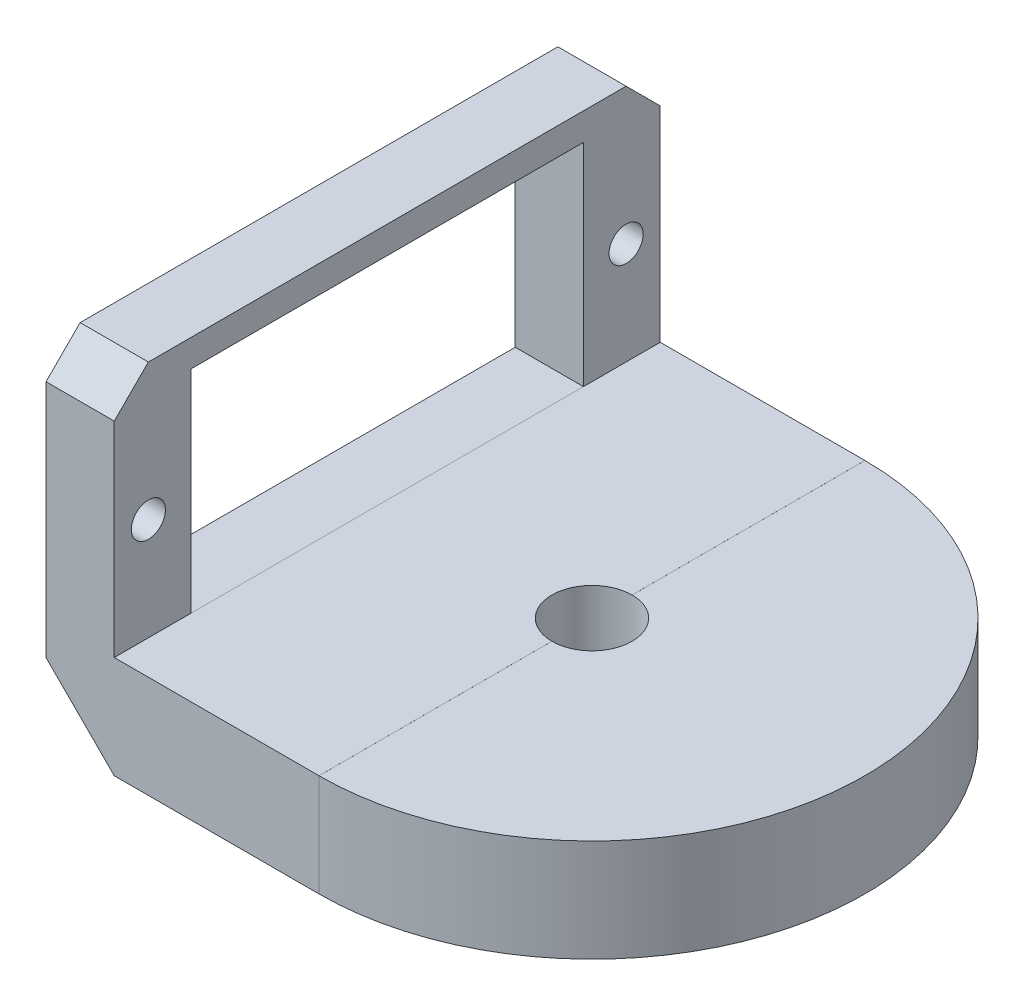
ISO-10303-21;
HEADER;
FILE_DESCRIPTION(('STEP AP214'),'2;1');
FILE_NAME('part.step','',(''),(''),'','','');
FILE_SCHEMA(('AUTOMOTIVE_DESIGN { 1 0 10303 214 1 1 1 1 }'));
ENDSEC;
DATA;
#1=APPLICATION_CONTEXT('core data for automotive mechanical design processes');
#2=APPLICATION_PROTOCOL_DEFINITION('international standard','automotive_design',2000,#1);
#3=PRODUCT_CONTEXT('',#1,'mechanical');
#4=PRODUCT('Part','Part','',(#3));
#5=PRODUCT_RELATED_PRODUCT_CATEGORY('part','',(#4));
#6=PRODUCT_DEFINITION_FORMATION('','',#4);
#7=PRODUCT_DEFINITION_CONTEXT('part definition',#1,'design');
#8=PRODUCT_DEFINITION('design','',#6,#7);
#9=PRODUCT_DEFINITION_SHAPE('','',#8);
#10=(LENGTH_UNIT() NAMED_UNIT(*) SI_UNIT(.MILLI.,.METRE.));
#11=(NAMED_UNIT(*) PLANE_ANGLE_UNIT() SI_UNIT($,.RADIAN.));
#12=(NAMED_UNIT(*) SI_UNIT($,.STERADIAN.) SOLID_ANGLE_UNIT());
#13=UNCERTAINTY_MEASURE_WITH_UNIT(LENGTH_MEASURE(1.E-05),#10,'distance_accuracy_value','');
#14=(GEOMETRIC_REPRESENTATION_CONTEXT(3) GLOBAL_UNCERTAINTY_ASSIGNED_CONTEXT((#13)) GLOBAL_UNIT_ASSIGNED_CONTEXT((#10,
#11,#12)) REPRESENTATION_CONTEXT('',''));
#15=CARTESIAN_POINT('',(0.,0.,0.));
#16=DIRECTION('',(0.,0.,1.));
#17=DIRECTION('',(1.,0.,0.));
#18=AXIS2_PLACEMENT_3D('',#15,#16,#17);
#19=CARTESIAN_POINT('',(16.,0.,0.));
#20=DIRECTION('',(1.,0.,0.));
#21=DIRECTION('',(0.,0.,-1.));
#22=AXIS2_PLACEMENT_3D('',#19,#20,#21);
#23=PLANE('',#22);
#24=DIRECTION('',(0.,-1.,0.));
#25=VECTOR('',#24,1.);
#26=CARTESIAN_POINT('',(16.,16.,-13.65));
#27=LINE('',#26,#25);
#28=CARTESIAN_POINT('',(16.,2.00126094570929,-13.65));
#29=VERTEX_POINT('',#28);
#30=CARTESIAN_POINT('',(16.,2.,-13.65));
#31=VERTEX_POINT('',#30);
#32=EDGE_CURVE('E173',#29,#31,#27,.T.);
#33=ORIENTED_EDGE('',*,*,#32,.F.);
#34=DIRECTION('',(0.,0.,1.));
#35=VECTOR('',#34,1.);
#36=CARTESIAN_POINT('',(16.,2.00126094570929,-32.));
#37=LINE('',#36,#35);
#38=CARTESIAN_POINT('',(16.,2.00126094570929,0.));
#39=VERTEX_POINT('',#38);
#40=EDGE_CURVE('E207',#29,#39,#37,.T.);
#41=ORIENTED_EDGE('',*,*,#40,.T.);
#42=DIRECTION('',(0.,-1.,0.));
#43=VECTOR('',#42,1.);
#44=CARTESIAN_POINT('',(16.,0.,0.));
#45=LINE('',#44,#43);
#46=CARTESIAN_POINT('',(16.,2.,0.));
#47=VERTEX_POINT('',#46);
#48=EDGE_CURVE('E211',#39,#47,#45,.T.);
#49=ORIENTED_EDGE('',*,*,#48,.T.);
#50=DIRECTION('',(0.,0.,-1.));
#51=VECTOR('',#50,1.);
#52=CARTESIAN_POINT('',(16.,2.,0.));
#53=LINE('',#52,#51);
#54=EDGE_CURVE('E194',#47,#31,#53,.T.);
#55=ORIENTED_EDGE('',*,*,#54,.T.);
#56=EDGE_LOOP('',(#33,#41,#49,#55));
#57=FACE_BOUND('',#56,.T.);
#58=ADVANCED_FACE('F45',(#57),#23,.T.);
#59=CARTESIAN_POINT('',(4.,1.6,-4.5));
#60=DIRECTION('',(0.,0.,-1.));
#61=DIRECTION('',(-1.,0.,0.));
#62=AXIS2_PLACEMENT_3D('',#59,#60,#61);
#63=PLANE('',#62);
#64=DIRECTION('',(0.,-1.,0.));
#65=VECTOR('',#64,1.);
#66=CARTESIAN_POINT('',(4.,1.6,-4.5));
#67=LINE('',#66,#65);
#68=CARTESIAN_POINT('',(4.,2.00126094570929,-4.5));
#69=VERTEX_POINT('',#68);
#70=CARTESIAN_POINT('',(4.,2.,-4.5));
#71=VERTEX_POINT('',#70);
#72=EDGE_CURVE('E234',#69,#71,#67,.T.);
#73=ORIENTED_EDGE('',*,*,#72,.T.);
#74=DIRECTION('',(-1.,0.,0.));
#75=VECTOR('',#74,1.);
#76=CARTESIAN_POINT('',(4.,2.,-4.5));
#77=LINE('',#76,#75);
#78=CARTESIAN_POINT('',(0.,2.,-4.5));
#79=VERTEX_POINT('',#78);
#80=EDGE_CURVE('E195',#71,#79,#77,.T.);
#81=ORIENTED_EDGE('',*,*,#80,.T.);
#82=DIRECTION('',(0.,-1.,0.));
#83=VECTOR('',#82,1.);
#84=CARTESIAN_POINT('',(0.,1.6,-4.5));
#85=LINE('',#84,#83);
#86=CARTESIAN_POINT('',(0.,14.4,-4.5));
#87=VERTEX_POINT('',#86);
#88=EDGE_CURVE('E228',#87,#79,#85,.T.);
#89=ORIENTED_EDGE('',*,*,#88,.F.);
#90=DIRECTION('',(-1.,0.,0.));
#91=VECTOR('',#90,1.);
#92=CARTESIAN_POINT('',(4.,14.4,-4.5));
#93=LINE('',#92,#91);
#94=CARTESIAN_POINT('',(4.,14.4,-4.5));
#95=VERTEX_POINT('',#94);
#96=EDGE_CURVE('E241',#95,#87,#93,.T.);
#97=ORIENTED_EDGE('',*,*,#96,.F.);
#98=EDGE_CURVE('E229',#95,#69,#67,.T.);
#99=ORIENTED_EDGE('',*,*,#98,.T.);
#100=EDGE_LOOP('',(#73,#81,#89,#97,#99));
#101=FACE_BOUND('',#100,.T.);
#102=ADVANCED_FACE('F384',(#101),#63,.T.);
#103=CARTESIAN_POINT('',(4.,1.6,-27.5));
#104=DIRECTION('',(0.,0.,1.));
#105=DIRECTION('',(1.,0.,0.));
#106=AXIS2_PLACEMENT_3D('',#103,#104,#105);
#107=PLANE('',#106);
#108=DIRECTION('',(0.,1.,0.));
#109=VECTOR('',#108,1.);
#110=CARTESIAN_POINT('',(0.,1.6,-27.5));
#111=LINE('',#110,#109);
#112=CARTESIAN_POINT('',(0.,2.,-27.5));
#113=VERTEX_POINT('',#112);
#114=CARTESIAN_POINT('',(0.,14.4,-27.5));
#115=VERTEX_POINT('',#114);
#116=EDGE_CURVE('E245',#113,#115,#111,.T.);
#117=ORIENTED_EDGE('',*,*,#116,.F.);
#118=DIRECTION('',(1.,0.,0.));
#119=VECTOR('',#118,1.);
#120=CARTESIAN_POINT('',(4.,2.,-27.5));
#121=LINE('',#120,#119);
#122=CARTESIAN_POINT('',(4.,2.,-27.5));
#123=VERTEX_POINT('',#122);
#124=EDGE_CURVE('E200',#113,#123,#121,.T.);
#125=ORIENTED_EDGE('',*,*,#124,.T.);
#126=DIRECTION('',(0.,1.,0.));
#127=VECTOR('',#126,1.);
#128=CARTESIAN_POINT('',(4.,1.6,-27.5));
#129=LINE('',#128,#127);
#130=CARTESIAN_POINT('',(4.,2.00126094570929,-27.5));
#131=VERTEX_POINT('',#130);
#132=EDGE_CURVE('E235',#123,#131,#129,.T.);
#133=ORIENTED_EDGE('',*,*,#132,.T.);
#134=CARTESIAN_POINT('',(4.,14.4,-27.5));
#135=VERTEX_POINT('',#134);
#136=EDGE_CURVE('E233',#131,#135,#129,.T.);
#137=ORIENTED_EDGE('',*,*,#136,.T.);
#138=DIRECTION('',(-1.,0.,0.));
#139=VECTOR('',#138,1.);
#140=CARTESIAN_POINT('',(4.,14.4,-27.5));
#141=LINE('',#140,#139);
#142=EDGE_CURVE('E255',#135,#115,#141,.T.);
#143=ORIENTED_EDGE('',*,*,#142,.T.);
#144=EDGE_LOOP('',(#117,#125,#133,#137,#143));
#145=FACE_BOUND('',#144,.T.);
#146=ADVANCED_FACE('F371',(#145),#107,.T.);
#147=DIRECTION('',(0.,-1.,0.));
#148=VECTOR('',#147,1.);
#149=CARTESIAN_POINT('',(16.,16.,-18.35));
#150=LINE('',#149,#148);
#151=CARTESIAN_POINT('',(16.,2.,-18.35));
#152=VERTEX_POINT('',#151);
#153=CARTESIAN_POINT('',(16.,2.00126094570929,-18.35));
#154=VERTEX_POINT('',#153);
#155=EDGE_CURVE('E170',#152,#154,#150,.F.);
#156=ORIENTED_EDGE('',*,*,#155,.F.);
#157=CARTESIAN_POINT('',(16.,2.,-32.));
#158=VERTEX_POINT('',#157);
#159=EDGE_CURVE('E183',#152,#158,#53,.T.);
#160=ORIENTED_EDGE('',*,*,#159,.T.);
#161=DIRECTION('',(0.,1.,0.));
#162=VECTOR('',#161,1.);
#163=CARTESIAN_POINT('',(16.,0.,-32.));
#164=LINE('',#163,#162);
#165=CARTESIAN_POINT('',(16.,2.00126094570929,-32.));
#166=VERTEX_POINT('',#165);
#167=EDGE_CURVE('E208',#158,#166,#164,.T.);
#168=ORIENTED_EDGE('',*,*,#167,.T.);
#169=EDGE_CURVE('E186',#166,#154,#37,.T.);
#170=ORIENTED_EDGE('',*,*,#169,.T.);
#171=EDGE_LOOP('',(#156,#160,#168,#170));
#172=FACE_BOUND('',#171,.T.);
#173=ADVANCED_FACE('F182',(#172),#23,.T.);
#174=CARTESIAN_POINT('',(4.,0.,0.));
#175=DIRECTION('',(1.,0.,0.));
#176=DIRECTION('',(0.,0.,-1.));
#177=AXIS2_PLACEMENT_3D('',#174,#175,#176);
#178=PLANE('',#177);
#179=DIRECTION('',(0.,0.,-1.));
#180=VECTOR('',#179,1.);
#181=CARTESIAN_POINT('',(4.,2.,0.));
#182=LINE('',#181,#180);
#183=EDGE_CURVE('E277',#71,#123,#182,.T.);
#184=ORIENTED_EDGE('',*,*,#183,.F.);
#185=ORIENTED_EDGE('',*,*,#72,.F.);
#186=DIRECTION('',(0.,0.,1.));
#187=VECTOR('',#186,1.);
#188=CARTESIAN_POINT('',(4.,2.00126094570929,-32.));
#189=LINE('',#188,#187);
#190=EDGE_CURVE('E199',#131,#69,#189,.T.);
#191=ORIENTED_EDGE('',*,*,#190,.F.);
#192=ORIENTED_EDGE('',*,*,#132,.F.);
#193=EDGE_LOOP('',(#184,#185,#191,#192));
#194=FACE_BOUND('',#193,.T.);
#195=ADVANCED_FACE('F380',(#194),#178,.F.);
#196=CARTESIAN_POINT('',(4.,0.,0.));
#197=DIRECTION('',(-1.,0.,0.));
#198=DIRECTION('',(0.,0.,1.));
#199=AXIS2_PLACEMENT_3D('',#196,#197,#198);
#200=PLANE('',#199);
#201=CARTESIAN_POINT('',(4.,8.,-30.));
#202=DIRECTION('',(-1.,0.,0.));
#203=DIRECTION('',(0.,0.,1.));
#204=AXIS2_PLACEMENT_3D('',#201,#202,#203);
#205=CIRCLE('',#204,1.);
#206=CARTESIAN_POINT('',(4.,8.,-29.));
#207=VERTEX_POINT('',#206);
#208=EDGE_CURVE('E463',#207,#207,#205,.T.);
#209=ORIENTED_EDGE('',*,*,#208,.T.);
#210=EDGE_LOOP('',(#209));
#211=FACE_BOUND('',#210,.T.);
#212=CARTESIAN_POINT('',(4.,8.00000000000001,-2.));
#213=DIRECTION('',(-1.,0.,0.));
#214=DIRECTION('',(0.,0.,1.));
#215=AXIS2_PLACEMENT_3D('',#212,#213,#214);
#216=CIRCLE('',#215,1.);
#217=CARTESIAN_POINT('',(4.,8.00000000000001,-0.999999999999999));
#218=VERTEX_POINT('',#217);
#219=EDGE_CURVE('E467',#218,#218,#216,.T.);
#220=ORIENTED_EDGE('',*,*,#219,.T.);
#221=EDGE_LOOP('',(#220));
#222=FACE_BOUND('',#221,.T.);
#223=DIRECTION('',(0.,0.,1.));
#224=VECTOR('',#223,1.);
#225=CARTESIAN_POINT('',(4.,16.,0.));
#226=LINE('',#225,#224);
#227=CARTESIAN_POINT('',(4.,16.,-30.));
#228=VERTEX_POINT('',#227);
#229=CARTESIAN_POINT('',(4.,16.,-2.00000000000002));
#230=VERTEX_POINT('',#229);
#231=EDGE_CURVE('E267',#228,#230,#226,.T.);
#232=ORIENTED_EDGE('',*,*,#231,.T.);
#233=DIRECTION('',(0.,0.707106781186546,-0.707106781186549));
#234=VECTOR('',#233,1.);
#235=CARTESIAN_POINT('',(4.,14.,0.));
#236=LINE('',#235,#234);
#237=CARTESIAN_POINT('',(4.,14.,0.));
#238=VERTEX_POINT('',#237);
#239=EDGE_CURVE('E55',#230,#238,#236,.F.);
#240=ORIENTED_EDGE('',*,*,#239,.T.);
#241=DIRECTION('',(0.,-1.,0.));
#242=VECTOR('',#241,1.);
#243=CARTESIAN_POINT('',(4.,0.,0.));
#244=LINE('',#243,#242);
#245=CARTESIAN_POINT('',(4.,2.00126094570929,0.));
#246=VERTEX_POINT('',#245);
#247=EDGE_CURVE('E260',#238,#246,#244,.T.);
#248=ORIENTED_EDGE('',*,*,#247,.T.);
#249=EDGE_CURVE('E220',#69,#246,#189,.T.);
#250=ORIENTED_EDGE('',*,*,#249,.F.);
#251=ORIENTED_EDGE('',*,*,#98,.F.);
#252=DIRECTION('',(0.,0.,1.));
#253=VECTOR('',#252,1.);
#254=CARTESIAN_POINT('',(4.,14.4,-4.5));
#255=LINE('',#254,#253);
#256=EDGE_CURVE('E238',#135,#95,#255,.T.);
#257=ORIENTED_EDGE('',*,*,#256,.F.);
#258=ORIENTED_EDGE('',*,*,#136,.F.);
#259=CARTESIAN_POINT('',(4.,2.00126094570929,-32.));
#260=VERTEX_POINT('',#259);
#261=EDGE_CURVE('E216',#260,#131,#189,.T.);
#262=ORIENTED_EDGE('',*,*,#261,.F.);
#263=DIRECTION('',(0.,1.,0.));
#264=VECTOR('',#263,1.);
#265=CARTESIAN_POINT('',(4.,0.,-32.));
#266=LINE('',#265,#264);
#267=CARTESIAN_POINT('',(4.,14.,-32.));
#268=VERTEX_POINT('',#267);
#269=EDGE_CURVE('E263',#260,#268,#266,.T.);
#270=ORIENTED_EDGE('',*,*,#269,.T.);
#271=DIRECTION('',(0.,-0.707106781186549,-0.707106781186546));
#272=VECTOR('',#271,1.);
#273=CARTESIAN_POINT('',(4.,16.,-30.));
#274=LINE('',#273,#272);
#275=EDGE_CURVE('E311',#268,#228,#274,.F.);
#276=ORIENTED_EDGE('',*,*,#275,.T.);
#277=EDGE_LOOP('',(#232,#240,#248,#250,#251,#257,#258,#262,#270,#276));
#278=FACE_BOUND('',#277,.T.);
#279=ADVANCED_FACE('F317',(#211,#222,#278),#200,.F.);
#280=CARTESIAN_POINT('',(0.,0.,0.));
#281=DIRECTION('',(-1.,0.,0.));
#282=DIRECTION('',(0.,0.,1.));
#283=AXIS2_PLACEMENT_3D('',#280,#281,#282);
#284=PLANE('',#283);
#285=CARTESIAN_POINT('',(0.,8.,-30.));
#286=DIRECTION('',(-1.,0.,0.));
#287=DIRECTION('',(0.,0.,1.));
#288=AXIS2_PLACEMENT_3D('',#285,#286,#287);
#289=CIRCLE('',#288,1.);
#290=CARTESIAN_POINT('',(0.,8.,-29.));
#291=VERTEX_POINT('',#290);
#292=EDGE_CURVE('E471',#291,#291,#289,.T.);
#293=ORIENTED_EDGE('',*,*,#292,.F.);
#294=EDGE_LOOP('',(#293));
#295=FACE_BOUND('',#294,.T.);
#296=CARTESIAN_POINT('',(0.,8.00000000000001,-2.));
#297=DIRECTION('',(-1.,0.,0.));
#298=DIRECTION('',(0.,0.,1.));
#299=AXIS2_PLACEMENT_3D('',#296,#297,#298);
#300=CIRCLE('',#299,1.);
#301=CARTESIAN_POINT('',(0.,8.00000000000001,-0.999999999999999));
#302=VERTEX_POINT('',#301);
#303=EDGE_CURVE('E472',#302,#302,#300,.T.);
#304=ORIENTED_EDGE('',*,*,#303,.F.);
#305=EDGE_LOOP('',(#304));
#306=FACE_BOUND('',#305,.T.);
#307=DIRECTION('',(0.,0.,-1.));
#308=VECTOR('',#307,1.);
#309=CARTESIAN_POINT('',(0.,2.,0.));
#310=LINE('',#309,#308);
#311=EDGE_CURVE('E357',#79,#113,#310,.T.);
#312=ORIENTED_EDGE('',*,*,#311,.T.);
#313=ORIENTED_EDGE('',*,*,#116,.T.);
#314=DIRECTION('',(0.,0.,1.));
#315=VECTOR('',#314,1.);
#316=CARTESIAN_POINT('',(0.,14.4,-4.5));
#317=LINE('',#316,#315);
#318=EDGE_CURVE('E248',#115,#87,#317,.T.);
#319=ORIENTED_EDGE('',*,*,#318,.T.);
#320=ORIENTED_EDGE('',*,*,#88,.T.);
#321=EDGE_LOOP('',(#312,#313,#319,#320));
#322=FACE_BOUND('',#321,.T.);
#323=DIRECTION('',(0.,-1.,0.));
#324=VECTOR('',#323,1.);
#325=CARTESIAN_POINT('',(0.,0.,0.));
#326=LINE('',#325,#324);
#327=CARTESIAN_POINT('',(0.,14.,0.));
#328=VERTEX_POINT('',#327);
#329=CARTESIAN_POINT('',(0.,0.,0.));
#330=VERTEX_POINT('',#329);
#331=EDGE_CURVE('E259',#328,#330,#326,.T.);
#332=ORIENTED_EDGE('',*,*,#331,.F.);
#333=DIRECTION('',(0.,-0.707106781186546,0.707106781186549));
#334=VECTOR('',#333,1.);
#335=CARTESIAN_POINT('',(0.,7.00000000000002,6.99999999999999));
#336=LINE('',#335,#334);
#337=CARTESIAN_POINT('',(0.,16.,-2.00000000000002));
#338=VERTEX_POINT('',#337);
#339=EDGE_CURVE('E302',#328,#338,#336,.F.);
#340=ORIENTED_EDGE('',*,*,#339,.T.);
#341=DIRECTION('',(0.,0.,1.));
#342=VECTOR('',#341,1.);
#343=CARTESIAN_POINT('',(0.,16.,0.));
#344=LINE('',#343,#342);
#345=CARTESIAN_POINT('',(0.,16.,-30.));
#346=VERTEX_POINT('',#345);
#347=EDGE_CURVE('E264',#346,#338,#344,.T.);
#348=ORIENTED_EDGE('',*,*,#347,.F.);
#349=DIRECTION('',(0.,0.707106781186549,0.707106781186546));
#350=VECTOR('',#349,1.);
#351=CARTESIAN_POINT('',(0.,23.,-23.));
#352=LINE('',#351,#350);
#353=CARTESIAN_POINT('',(0.,14.,-32.));
#354=VERTEX_POINT('',#353);
#355=EDGE_CURVE('E299',#346,#354,#352,.F.);
#356=ORIENTED_EDGE('',*,*,#355,.T.);
#357=DIRECTION('',(0.,1.,0.));
#358=VECTOR('',#357,1.);
#359=CARTESIAN_POINT('',(0.,0.,-32.));
#360=LINE('',#359,#358);
#361=CARTESIAN_POINT('',(0.,0.,-32.));
#362=VERTEX_POINT('',#361);
#363=EDGE_CURVE('E272',#362,#354,#360,.T.);
#364=ORIENTED_EDGE('',*,*,#363,.F.);
#365=DIRECTION('',(0.,0.,1.));
#366=VECTOR('',#365,1.);
#367=CARTESIAN_POINT('',(0.,0.,0.));
#368=LINE('',#367,#366);
#369=EDGE_CURVE('E288',#362,#330,#368,.T.);
#370=ORIENTED_EDGE('',*,*,#369,.T.);
#371=EDGE_LOOP('',(#332,#340,#348,#356,#364,#370));
#372=FACE_BOUND('',#371,.T.);
#373=ADVANCED_FACE('F329',(#295,#306,#322,#372),#284,.T.);
#374=CARTESIAN_POINT('',(4.,0.,0.));
#375=DIRECTION('',(0.,0.,-1.));
#376=DIRECTION('',(-1.,0.,0.));
#377=AXIS2_PLACEMENT_3D('',#374,#375,#376);
#378=PLANE('',#377);
#379=ORIENTED_EDGE('',*,*,#247,.F.);
#380=DIRECTION('',(-1.,0.,0.));
#381=VECTOR('',#380,1.);
#382=CARTESIAN_POINT('',(4.,14.,0.));
#383=LINE('',#382,#381);
#384=EDGE_CURVE('E295',#238,#328,#383,.T.);
#385=ORIENTED_EDGE('',*,*,#384,.T.);
#386=ORIENTED_EDGE('',*,*,#331,.T.);
#387=DIRECTION('',(-0.707106781186546,0.707106781186549,0.));
#388=VECTOR('',#387,1.);
#389=CARTESIAN_POINT('',(4.,-4.,0.));
#390=LINE('',#389,#388);
#391=CARTESIAN_POINT('',(4.,-4.,0.));
#392=VERTEX_POINT('',#391);
#393=EDGE_CURVE('E292',#330,#392,#390,.F.);
#394=ORIENTED_EDGE('',*,*,#393,.T.);
#395=DIRECTION('',(-1.,0.,0.));
#396=VECTOR('',#395,1.);
#397=CARTESIAN_POINT('',(0.,-4.,0.));
#398=LINE('',#397,#396);
#399=CARTESIAN_POINT('',(16.,-4.,0.));
#400=VERTEX_POINT('',#399);
#401=EDGE_CURVE('E349',#400,#392,#398,.T.);
#402=ORIENTED_EDGE('',*,*,#401,.F.);
#403=DIRECTION('',(0.,-1.,0.));
#404=VECTOR('',#403,1.);
#405=CARTESIAN_POINT('',(16.,2.,0.));
#406=LINE('',#405,#404);
#407=EDGE_CURVE('E365',#47,#400,#406,.T.);
#408=ORIENTED_EDGE('',*,*,#407,.F.);
#409=ORIENTED_EDGE('',*,*,#48,.F.);
#410=DIRECTION('',(-1.,0.,0.));
#411=VECTOR('',#410,1.);
#412=CARTESIAN_POINT('',(16.,2.00126094570929,0.));
#413=LINE('',#412,#411);
#414=EDGE_CURVE('E215',#39,#246,#413,.T.);
#415=ORIENTED_EDGE('',*,*,#414,.T.);
#416=EDGE_LOOP('',(#379,#385,#386,#394,#402,#408,#409,#415));
#417=FACE_BOUND('',#416,.T.);
#418=ADVANCED_FACE('F322',(#417),#378,.F.);
#419=CARTESIAN_POINT('',(4.,0.,-32.));
#420=DIRECTION('',(0.,0.,1.));
#421=DIRECTION('',(1.,0.,0.));
#422=AXIS2_PLACEMENT_3D('',#419,#420,#421);
#423=PLANE('',#422);
#424=ORIENTED_EDGE('',*,*,#363,.T.);
#425=DIRECTION('',(1.,0.,0.));
#426=VECTOR('',#425,1.);
#427=CARTESIAN_POINT('',(4.,14.,-32.));
#428=LINE('',#427,#426);
#429=EDGE_CURVE('E11',#354,#268,#428,.T.);
#430=ORIENTED_EDGE('',*,*,#429,.T.);
#431=ORIENTED_EDGE('',*,*,#269,.F.);
#432=DIRECTION('',(-1.,0.,0.));
#433=VECTOR('',#432,1.);
#434=CARTESIAN_POINT('',(16.,2.00126094570929,-32.));
#435=LINE('',#434,#433);
#436=EDGE_CURVE('E224',#166,#260,#435,.T.);
#437=ORIENTED_EDGE('',*,*,#436,.F.);
#438=ORIENTED_EDGE('',*,*,#167,.F.);
#439=CARTESIAN_POINT('',(16.,-4.,-32.));
#440=VERTEX_POINT('',#439);
#441=EDGE_CURVE('E204',#440,#158,#164,.T.);
#442=ORIENTED_EDGE('',*,*,#441,.F.);
#443=DIRECTION('',(1.,0.,0.));
#444=VECTOR('',#443,1.);
#445=CARTESIAN_POINT('',(0.,-4.,-32.));
#446=LINE('',#445,#444);
#447=CARTESIAN_POINT('',(4.,-4.,-32.));
#448=VERTEX_POINT('',#447);
#449=EDGE_CURVE('E339',#448,#440,#446,.T.);
#450=ORIENTED_EDGE('',*,*,#449,.F.);
#451=DIRECTION('',(0.707106781186546,-0.707106781186549,0.));
#452=VECTOR('',#451,1.);
#453=CARTESIAN_POINT('',(4.,-4.,-32.));
#454=LINE('',#453,#452);
#455=EDGE_CURVE('E285',#448,#362,#454,.F.);
#456=ORIENTED_EDGE('',*,*,#455,.T.);
#457=EDGE_LOOP('',(#424,#430,#431,#437,#438,#442,#450,#456));
#458=FACE_BOUND('',#457,.T.);
#459=ADVANCED_FACE('F336',(#458),#423,.F.);
#460=CARTESIAN_POINT('',(4.,16.,0.));
#461=DIRECTION('',(0.,-1.,0.));
#462=DIRECTION('',(0.,0.,-1.));
#463=AXIS2_PLACEMENT_3D('',#460,#461,#462);
#464=PLANE('',#463);
#465=ORIENTED_EDGE('',*,*,#347,.T.);
#466=DIRECTION('',(1.,0.,0.));
#467=VECTOR('',#466,1.);
#468=CARTESIAN_POINT('',(4.,16.,-2.00000000000002));
#469=LINE('',#468,#467);
#470=EDGE_CURVE('E68',#338,#230,#469,.T.);
#471=ORIENTED_EDGE('',*,*,#470,.T.);
#472=ORIENTED_EDGE('',*,*,#231,.F.);
#473=DIRECTION('',(-1.,0.,0.));
#474=VECTOR('',#473,1.);
#475=CARTESIAN_POINT('',(4.,16.,-30.));
#476=LINE('',#475,#474);
#477=EDGE_CURVE('E305',#228,#346,#476,.T.);
#478=ORIENTED_EDGE('',*,*,#477,.T.);
#479=EDGE_LOOP('',(#465,#471,#472,#478));
#480=FACE_BOUND('',#479,.T.);
#481=ADVANCED_FACE('F330',(#480),#464,.F.);
#482=CARTESIAN_POINT('',(4.,14.4,-4.5));
#483=DIRECTION('',(0.,-1.,0.));
#484=DIRECTION('',(0.,0.,-1.));
#485=AXIS2_PLACEMENT_3D('',#482,#483,#484);
#486=PLANE('',#485);
#487=ORIENTED_EDGE('',*,*,#318,.F.);
#488=ORIENTED_EDGE('',*,*,#142,.F.);
#489=ORIENTED_EDGE('',*,*,#256,.T.);
#490=ORIENTED_EDGE('',*,*,#96,.T.);
#491=EDGE_LOOP('',(#487,#488,#489,#490));
#492=FACE_BOUND('',#491,.T.);
#493=ADVANCED_FACE('F400',(#492),#486,.T.);
#494=CARTESIAN_POINT('',(16.,2.00126094570929,-32.));
#495=DIRECTION('',(0.,-1.,0.));
#496=DIRECTION('',(0.,0.,-1.));
#497=AXIS2_PLACEMENT_3D('',#494,#495,#496);
#498=PLANE('',#497);
#499=ORIENTED_EDGE('',*,*,#40,.F.);
#500=CARTESIAN_POINT('',(16.,2.00126094570929,-16.));
#501=DIRECTION('',(0.,-1.,0.));
#502=DIRECTION('',(0.,0.,-1.));
#503=AXIS2_PLACEMENT_3D('',#500,#501,#502);
#504=CIRCLE('',#503,2.35);
#505=EDGE_CURVE('E452',#29,#154,#504,.T.);
#506=ORIENTED_EDGE('',*,*,#505,.T.);
#507=ORIENTED_EDGE('',*,*,#169,.F.);
#508=ORIENTED_EDGE('',*,*,#436,.T.);
#509=ORIENTED_EDGE('',*,*,#261,.T.);
#510=ORIENTED_EDGE('',*,*,#190,.T.);
#511=ORIENTED_EDGE('',*,*,#249,.T.);
#512=ORIENTED_EDGE('',*,*,#414,.F.);
#513=EDGE_LOOP('',(#499,#506,#507,#508,#509,#510,#511,#512));
#514=FACE_BOUND('',#513,.T.);
#515=ADVANCED_FACE('F395',(#514),#498,.F.);
#516=CARTESIAN_POINT('',(16.,2.,-16.));
#517=DIRECTION('',(0.,-1.,0.));
#518=DIRECTION('',(0.,0.,-1.));
#519=AXIS2_PLACEMENT_3D('',#516,#517,#518);
#520=PLANE('',#519);
#521=ORIENTED_EDGE('',*,*,#80,.F.);
#522=ORIENTED_EDGE('',*,*,#183,.T.);
#523=ORIENTED_EDGE('',*,*,#124,.F.);
#524=ORIENTED_EDGE('',*,*,#311,.F.);
#525=EDGE_LOOP('',(#521,#522,#523,#524));
#526=FACE_BOUND('',#525,.T.);
#527=ADVANCED_FACE('F376',(#526),#520,.F.);
#528=ORIENTED_EDGE('',*,*,#159,.F.);
#529=CARTESIAN_POINT('',(16.,2.,-16.));
#530=DIRECTION('',(0.,-1.,0.));
#531=DIRECTION('',(0.,0.,-1.));
#532=AXIS2_PLACEMENT_3D('',#529,#530,#531);
#533=CIRCLE('',#532,2.35);
#534=EDGE_CURVE('E167',#152,#31,#533,.T.);
#535=ORIENTED_EDGE('',*,*,#534,.T.);
#536=ORIENTED_EDGE('',*,*,#54,.F.);
#537=CARTESIAN_POINT('',(16.,2.,-16.));
#538=DIRECTION('',(0.,-1.,0.));
#539=DIRECTION('',(0.,0.,-1.));
#540=AXIS2_PLACEMENT_3D('',#537,#538,#539);
#541=CIRCLE('',#540,16.);
#542=EDGE_CURVE('E191',#158,#47,#541,.T.);
#543=ORIENTED_EDGE('',*,*,#542,.F.);
#544=EDGE_LOOP('',(#528,#535,#536,#543));
#545=FACE_BOUND('',#544,.T.);
#546=ADVANCED_FACE('F189',(#545),#520,.F.);
#547=CARTESIAN_POINT('',(16.,2.,-16.));
#548=DIRECTION('',(0.,-1.,0.));
#549=DIRECTION('',(0.,0.,-1.));
#550=AXIS2_PLACEMENT_3D('',#547,#548,#549);
#551=CYLINDRICAL_SURFACE('',#550,16.);
#552=ORIENTED_EDGE('',*,*,#407,.T.);
#553=CARTESIAN_POINT('',(16.,-4.,-16.));
#554=DIRECTION('',(0.,-1.,0.));
#555=DIRECTION('',(0.,0.,-1.));
#556=AXIS2_PLACEMENT_3D('',#553,#554,#555);
#557=CIRCLE('',#556,16.);
#558=EDGE_CURVE('E351',#440,#400,#557,.T.);
#559=ORIENTED_EDGE('',*,*,#558,.F.);
#560=ORIENTED_EDGE('',*,*,#441,.T.);
#561=ORIENTED_EDGE('',*,*,#542,.T.);
#562=EDGE_LOOP('',(#552,#559,#560,#561));
#563=FACE_BOUND('',#562,.T.);
#564=ADVANCED_FACE('F443',(#563),#551,.T.);
#565=CARTESIAN_POINT('',(16.,-4.,-16.));
#566=DIRECTION('',(0.,-1.,0.));
#567=DIRECTION('',(0.,0.,-1.));
#568=AXIS2_PLACEMENT_3D('',#565,#566,#567);
#569=PLANE('',#568);
#570=CARTESIAN_POINT('',(16.,-4.,-16.));
#571=DIRECTION('',(0.,-1.,0.));
#572=DIRECTION('',(0.,0.,-1.));
#573=AXIS2_PLACEMENT_3D('',#570,#571,#572);
#574=CIRCLE('',#573,2.35);
#575=CARTESIAN_POINT('',(16.,-4.,-18.35));
#576=VERTEX_POINT('',#575);
#577=EDGE_CURVE('E178',#576,#576,#574,.T.);
#578=ORIENTED_EDGE('',*,*,#577,.F.);
#579=EDGE_LOOP('',(#578));
#580=FACE_BOUND('',#579,.T.);
#581=ORIENTED_EDGE('',*,*,#401,.T.);
#582=DIRECTION('',(0.,0.,-1.));
#583=VECTOR('',#582,1.);
#584=CARTESIAN_POINT('',(4.,-4.,-16.));
#585=LINE('',#584,#583);
#586=EDGE_CURVE('E281',#392,#448,#585,.T.);
#587=ORIENTED_EDGE('',*,*,#586,.T.);
#588=ORIENTED_EDGE('',*,*,#449,.T.);
#589=ORIENTED_EDGE('',*,*,#558,.T.);
#590=EDGE_LOOP('',(#581,#587,#588,#589));
#591=FACE_BOUND('',#590,.T.);
#592=ADVANCED_FACE('F346',(#580,#591),#569,.T.);
#593=CARTESIAN_POINT('',(4.,-4.,-16.));
#594=DIRECTION('',(0.707106781186549,0.707106781186546,0.));
#595=DIRECTION('',(0.,0.,-1.));
#596=AXIS2_PLACEMENT_3D('',#593,#594,#595);
#597=PLANE('',#596);
#598=ORIENTED_EDGE('',*,*,#393,.F.);
#599=ORIENTED_EDGE('',*,*,#369,.F.);
#600=ORIENTED_EDGE('',*,*,#455,.F.);
#601=ORIENTED_EDGE('',*,*,#586,.F.);
#602=EDGE_LOOP('',(#598,#599,#600,#601));
#603=FACE_BOUND('',#602,.T.);
#604=ADVANCED_FACE('F343',(#603),#597,.F.);
#605=CARTESIAN_POINT('',(16.,16.,-16.));
#606=DIRECTION('',(0.,-1.,0.));
#607=DIRECTION('',(0.,0.,-1.));
#608=AXIS2_PLACEMENT_3D('',#605,#606,#607);
#609=CYLINDRICAL_SURFACE('',#608,2.35);
#610=ORIENTED_EDGE('',*,*,#577,.T.);
#611=EDGE_LOOP('',(#610));
#612=FACE_BOUND('',#611,.T.);
#613=ORIENTED_EDGE('',*,*,#32,.T.);
#614=ORIENTED_EDGE('',*,*,#534,.F.);
#615=ORIENTED_EDGE('',*,*,#155,.T.);
#616=ORIENTED_EDGE('',*,*,#505,.F.);
#617=EDGE_LOOP('',(#613,#614,#615,#616));
#618=FACE_BOUND('',#617,.T.);
#619=ADVANCED_FACE('F169',(#612,#618),#609,.F.);
#620=CARTESIAN_POINT('',(32.,8.00000000000001,-2.));
#621=DIRECTION('',(-1.,0.,0.));
#622=DIRECTION('',(0.,0.,1.));
#623=AXIS2_PLACEMENT_3D('',#620,#621,#622);
#624=CYLINDRICAL_SURFACE('',#623,1.);
#625=ORIENTED_EDGE('',*,*,#303,.T.);
#626=EDGE_LOOP('',(#625));
#627=FACE_BOUND('',#626,.T.);
#628=ORIENTED_EDGE('',*,*,#219,.F.);
#629=EDGE_LOOP('',(#628));
#630=FACE_BOUND('',#629,.T.);
#631=ADVANCED_FACE('F482',(#627,#630),#624,.F.);
#632=CARTESIAN_POINT('',(32.,8.,-30.));
#633=DIRECTION('',(-1.,0.,0.));
#634=DIRECTION('',(0.,0.,1.));
#635=AXIS2_PLACEMENT_3D('',#632,#633,#634);
#636=CYLINDRICAL_SURFACE('',#635,1.);
#637=ORIENTED_EDGE('',*,*,#292,.T.);
#638=EDGE_LOOP('',(#637));
#639=FACE_BOUND('',#638,.T.);
#640=ORIENTED_EDGE('',*,*,#208,.F.);
#641=EDGE_LOOP('',(#640));
#642=FACE_BOUND('',#641,.T.);
#643=ADVANCED_FACE('F479',(#639,#642),#636,.F.);
#644=CARTESIAN_POINT('',(4.,14.,0.));
#645=DIRECTION('',(0.,-0.707106781186549,-0.707106781186546));
#646=DIRECTION('',(-1.,0.,0.));
#647=AXIS2_PLACEMENT_3D('',#644,#645,#646);
#648=PLANE('',#647);
#649=ORIENTED_EDGE('',*,*,#239,.F.);
#650=ORIENTED_EDGE('',*,*,#470,.F.);
#651=ORIENTED_EDGE('',*,*,#339,.F.);
#652=ORIENTED_EDGE('',*,*,#384,.F.);
#653=EDGE_LOOP('',(#649,#650,#651,#652));
#654=FACE_BOUND('',#653,.T.);
#655=ADVANCED_FACE('F326',(#654),#648,.F.);
#656=CARTESIAN_POINT('',(4.,16.,-30.));
#657=DIRECTION('',(0.,-0.707106781186546,0.707106781186549));
#658=DIRECTION('',(-1.,0.,0.));
#659=AXIS2_PLACEMENT_3D('',#656,#657,#658);
#660=PLANE('',#659);
#661=ORIENTED_EDGE('',*,*,#275,.F.);
#662=ORIENTED_EDGE('',*,*,#429,.F.);
#663=ORIENTED_EDGE('',*,*,#355,.F.);
#664=ORIENTED_EDGE('',*,*,#477,.F.);
#665=EDGE_LOOP('',(#661,#662,#663,#664));
#666=FACE_BOUND('',#665,.T.);
#667=ADVANCED_FACE('F48',(#666),#660,.F.);
#668=CLOSED_SHELL('',(#58,#102,#146,#173,#195,#279,#373,#418,#459,#481,#493,#515,#527,#546,#564,
#592,#604,#619,#631,#643,#655,#667));
#669=MANIFOLD_SOLID_BREP('B2',#668);
#670=ADVANCED_BREP_SHAPE_REPRESENTATION('',(#18,#669),#14);
#671=SHAPE_DEFINITION_REPRESENTATION(#9,#670);
ENDSEC;
END-ISO-10303-21;
